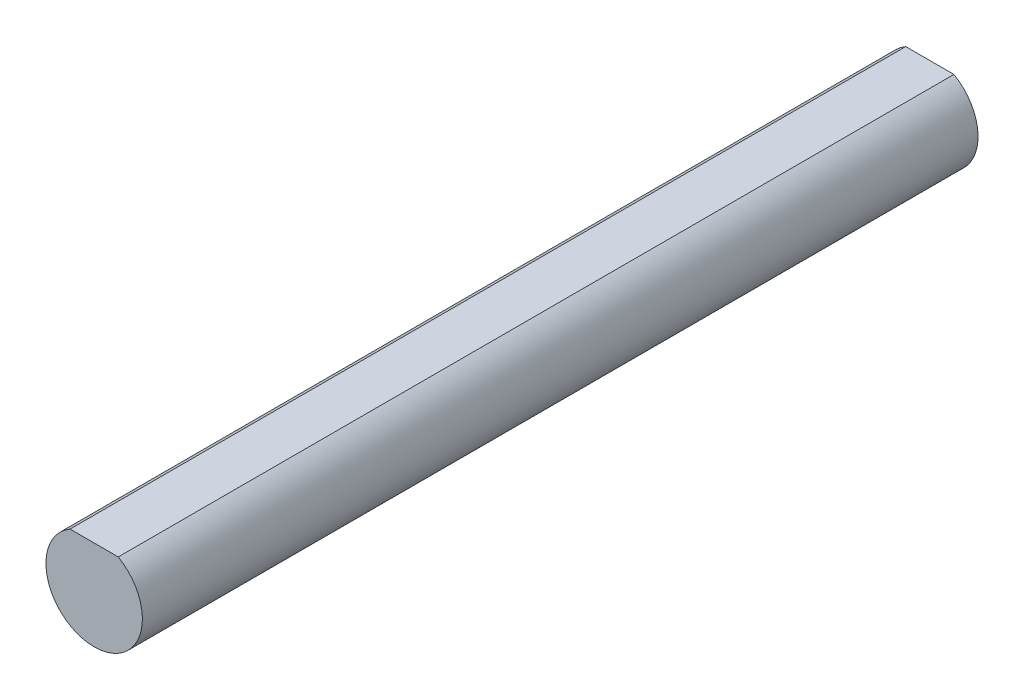
ISO-10303-21;
HEADER;
FILE_DESCRIPTION(('STEP AP214'),'2;1');
FILE_NAME('part.step','',(''),(''),'','','');
FILE_SCHEMA(('AUTOMOTIVE_DESIGN { 1 0 10303 214 1 1 1 1 }'));
ENDSEC;
DATA;
#1=APPLICATION_CONTEXT('core data for automotive mechanical design processes');
#2=APPLICATION_PROTOCOL_DEFINITION('international standard','automotive_design',2000,#1);
#3=PRODUCT_CONTEXT('',#1,'mechanical');
#4=PRODUCT('Part','Part','',(#3));
#5=PRODUCT_RELATED_PRODUCT_CATEGORY('part','',(#4));
#6=PRODUCT_DEFINITION_FORMATION('','',#4);
#7=PRODUCT_DEFINITION_CONTEXT('part definition',#1,'design');
#8=PRODUCT_DEFINITION('design','',#6,#7);
#9=PRODUCT_DEFINITION_SHAPE('','',#8);
#10=(LENGTH_UNIT() NAMED_UNIT(*) SI_UNIT(.MILLI.,.METRE.));
#11=(NAMED_UNIT(*) PLANE_ANGLE_UNIT() SI_UNIT($,.RADIAN.));
#12=(NAMED_UNIT(*) SI_UNIT($,.STERADIAN.) SOLID_ANGLE_UNIT());
#13=UNCERTAINTY_MEASURE_WITH_UNIT(LENGTH_MEASURE(1.E-05),#10,'distance_accuracy_value','');
#14=(GEOMETRIC_REPRESENTATION_CONTEXT(3) GLOBAL_UNCERTAINTY_ASSIGNED_CONTEXT((#13)) GLOBAL_UNIT_ASSIGNED_CONTEXT((#10,
#11,#12)) REPRESENTATION_CONTEXT('',''));
#15=CARTESIAN_POINT('',(0.,0.,0.));
#16=DIRECTION('',(0.,0.,1.));
#17=DIRECTION('',(1.,0.,0.));
#18=AXIS2_PLACEMENT_3D('',#15,#16,#17);
#19=CARTESIAN_POINT('',(0.,0.,52.));
#20=DIRECTION('',(0.,0.,-1.));
#21=DIRECTION('',(-1.,0.,0.));
#22=AXIS2_PLACEMENT_3D('',#19,#20,#21);
#23=CYLINDRICAL_SURFACE('',#22,3.);
#24=CARTESIAN_POINT('',(0.,0.,0.));
#25=DIRECTION('',(0.,0.,1.));
#26=DIRECTION('',(1.,0.,0.));
#27=AXIS2_PLACEMENT_3D('',#24,#25,#26);
#28=CIRCLE('',#27,3.);
#29=CARTESIAN_POINT('',(-1.5,2.59807621135332,0.));
#30=VERTEX_POINT('',#29);
#31=CARTESIAN_POINT('',(1.5,2.59807621135332,0.));
#32=VERTEX_POINT('',#31);
#33=EDGE_CURVE('E72',#30,#32,#28,.T.);
#34=ORIENTED_EDGE('',*,*,#33,.T.);
#35=DIRECTION('',(0.,0.,-1.));
#36=VECTOR('',#35,1.);
#37=CARTESIAN_POINT('',(1.5,2.59807621135332,52.));
#38=LINE('',#37,#36);
#39=CARTESIAN_POINT('',(1.5,2.59807621135332,52.));
#40=VERTEX_POINT('',#39);
#41=EDGE_CURVE('E11',#40,#32,#38,.T.);
#42=ORIENTED_EDGE('',*,*,#41,.F.);
#43=CARTESIAN_POINT('',(0.,0.,52.));
#44=DIRECTION('',(0.,0.,1.));
#45=DIRECTION('',(1.,0.,0.));
#46=AXIS2_PLACEMENT_3D('',#43,#44,#45);
#47=CIRCLE('',#46,3.);
#48=CARTESIAN_POINT('',(-1.5,2.59807621135332,52.));
#49=VERTEX_POINT('',#48);
#50=EDGE_CURVE('E71',#49,#40,#47,.T.);
#51=ORIENTED_EDGE('',*,*,#50,.F.);
#52=DIRECTION('',(0.,0.,-1.));
#53=VECTOR('',#52,1.);
#54=CARTESIAN_POINT('',(-1.5,2.59807621135332,52.));
#55=LINE('',#54,#53);
#56=EDGE_CURVE('E48',#49,#30,#55,.T.);
#57=ORIENTED_EDGE('',*,*,#56,.T.);
#58=EDGE_LOOP('',(#34,#42,#51,#57));
#59=FACE_BOUND('',#58,.T.);
#60=ADVANCED_FACE('F39',(#59),#23,.T.);
#61=CARTESIAN_POINT('',(-1.5,2.59807621135332,52.));
#62=DIRECTION('',(0.,-1.,0.));
#63=DIRECTION('',(0.,0.,-1.));
#64=AXIS2_PLACEMENT_3D('',#61,#62,#63);
#65=PLANE('',#64);
#66=DIRECTION('',(-1.,0.,0.));
#67=VECTOR('',#66,1.);
#68=CARTESIAN_POINT('',(-1.5,2.59807621135332,0.));
#69=LINE('',#68,#67);
#70=EDGE_CURVE('E63',#32,#30,#69,.T.);
#71=ORIENTED_EDGE('',*,*,#70,.T.);
#72=ORIENTED_EDGE('',*,*,#56,.F.);
#73=DIRECTION('',(-1.,0.,0.));
#74=VECTOR('',#73,1.);
#75=CARTESIAN_POINT('',(-1.5,2.59807621135332,52.));
#76=LINE('',#75,#74);
#77=EDGE_CURVE('E55',#40,#49,#76,.T.);
#78=ORIENTED_EDGE('',*,*,#77,.F.);
#79=ORIENTED_EDGE('',*,*,#41,.T.);
#80=EDGE_LOOP('',(#71,#72,#78,#79));
#81=FACE_BOUND('',#80,.T.);
#82=ADVANCED_FACE('F66',(#81),#65,.F.);
#83=CARTESIAN_POINT('',(0.,0.,52.));
#84=DIRECTION('',(0.,0.,1.));
#85=DIRECTION('',(1.,0.,0.));
#86=AXIS2_PLACEMENT_3D('',#83,#84,#85);
#87=PLANE('',#86);
#88=ORIENTED_EDGE('',*,*,#50,.T.);
#89=ORIENTED_EDGE('',*,*,#77,.T.);
#90=EDGE_LOOP('',(#88,#89));
#91=FACE_BOUND('',#90,.T.);
#92=ADVANCED_FACE('F83',(#91),#87,.T.);
#93=CARTESIAN_POINT('',(0.,0.,0.));
#94=DIRECTION('',(0.,0.,1.));
#95=DIRECTION('',(1.,0.,0.));
#96=AXIS2_PLACEMENT_3D('',#93,#94,#95);
#97=PLANE('',#96);
#98=ORIENTED_EDGE('',*,*,#33,.F.);
#99=ORIENTED_EDGE('',*,*,#70,.F.);
#100=EDGE_LOOP('',(#98,#99));
#101=FACE_BOUND('',#100,.T.);
#102=ADVANCED_FACE('F76',(#101),#97,.F.);
#103=CLOSED_SHELL('',(#60,#82,#92,#102));
#104=MANIFOLD_SOLID_BREP('B2',#103);
#105=ADVANCED_BREP_SHAPE_REPRESENTATION('',(#18,#104),#14);
#106=SHAPE_DEFINITION_REPRESENTATION(#9,#105);
ENDSEC;
END-ISO-10303-21;
